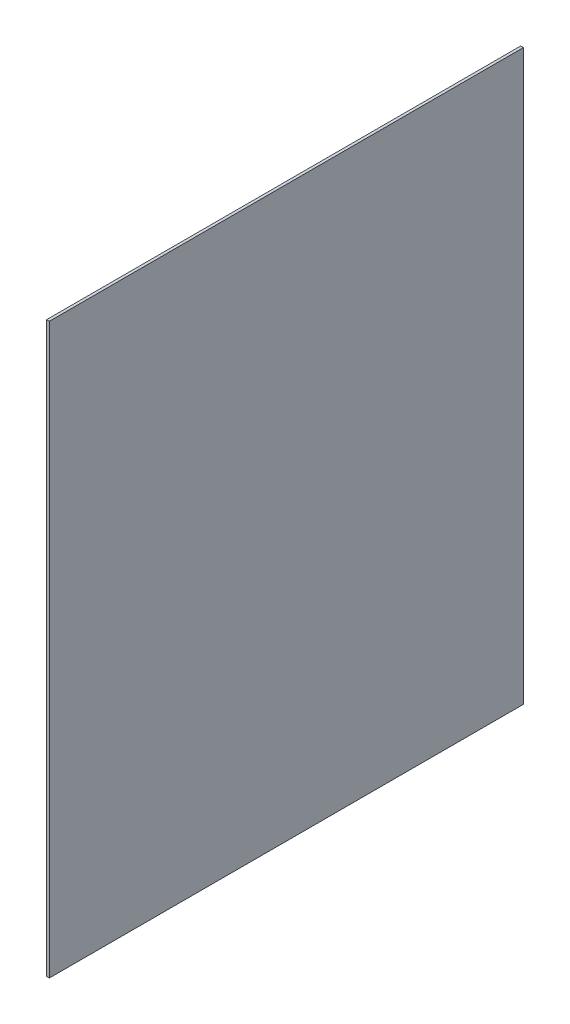
ISO-10303-21;
HEADER;
FILE_DESCRIPTION(('STEP AP214'),'2;1');
FILE_NAME('part.step','',(''),(''),'','','');
FILE_SCHEMA(('AUTOMOTIVE_DESIGN { 1 0 10303 214 1 1 1 1 }'));
ENDSEC;
DATA;
#1=APPLICATION_CONTEXT('core data for automotive mechanical design processes');
#2=APPLICATION_PROTOCOL_DEFINITION('international standard','automotive_design',2000,#1);
#3=PRODUCT_CONTEXT('',#1,'mechanical');
#4=PRODUCT('Part','Part','',(#3));
#5=PRODUCT_RELATED_PRODUCT_CATEGORY('part','',(#4));
#6=PRODUCT_DEFINITION_FORMATION('','',#4);
#7=PRODUCT_DEFINITION_CONTEXT('part definition',#1,'design');
#8=PRODUCT_DEFINITION('design','',#6,#7);
#9=PRODUCT_DEFINITION_SHAPE('','',#8);
#10=(LENGTH_UNIT() NAMED_UNIT(*) SI_UNIT(.MILLI.,.METRE.));
#11=(NAMED_UNIT(*) PLANE_ANGLE_UNIT() SI_UNIT($,.RADIAN.));
#12=(NAMED_UNIT(*) SI_UNIT($,.STERADIAN.) SOLID_ANGLE_UNIT());
#13=UNCERTAINTY_MEASURE_WITH_UNIT(LENGTH_MEASURE(1.E-05),#10,'distance_accuracy_value','');
#14=(GEOMETRIC_REPRESENTATION_CONTEXT(3) GLOBAL_UNCERTAINTY_ASSIGNED_CONTEXT((#13)) GLOBAL_UNIT_ASSIGNED_CONTEXT((#10,
#11,#12)) REPRESENTATION_CONTEXT('',''));
#15=CARTESIAN_POINT('',(0.,0.,0.));
#16=DIRECTION('',(0.,0.,1.));
#17=DIRECTION('',(1.,0.,0.));
#18=AXIS2_PLACEMENT_3D('',#15,#16,#17);
#19=CARTESIAN_POINT('',(-12.5,-2580.0927159835,2150.));
#20=DIRECTION('',(1.,0.,0.));
#21=DIRECTION('',(0.,0.,-1.));
#22=AXIS2_PLACEMENT_3D('',#19,#20,#21);
#23=PLANE('',#22);
#24=DIRECTION('',(0.,-1.,0.));
#25=VECTOR('',#24,1.);
#26=CARTESIAN_POINT('',(-12.5,-2580.0927159835,-2150.));
#27=LINE('',#26,#25);
#28=CARTESIAN_POINT('',(-12.5,2580.0927159835,-2150.));
#29=VERTEX_POINT('',#28);
#30=CARTESIAN_POINT('',(-12.5,-2580.0927159835,-2150.));
#31=VERTEX_POINT('',#30);
#32=EDGE_CURVE('E105',#29,#31,#27,.T.);
#33=ORIENTED_EDGE('',*,*,#32,.T.);
#34=DIRECTION('',(0.,0.,-1.));
#35=VECTOR('',#34,1.);
#36=CARTESIAN_POINT('',(-12.5,-2580.0927159835,2150.));
#37=LINE('',#36,#35);
#38=CARTESIAN_POINT('',(-12.5,-2580.0927159835,2150.));
#39=VERTEX_POINT('',#38);
#40=EDGE_CURVE('E11',#39,#31,#37,.T.);
#41=ORIENTED_EDGE('',*,*,#40,.F.);
#42=DIRECTION('',(0.,-1.,0.));
#43=VECTOR('',#42,1.);
#44=CARTESIAN_POINT('',(-12.5,-2580.0927159835,2150.));
#45=LINE('',#44,#43);
#46=CARTESIAN_POINT('',(-12.5,2580.0927159835,2150.));
#47=VERTEX_POINT('',#46);
#48=EDGE_CURVE('E89',#47,#39,#45,.T.);
#49=ORIENTED_EDGE('',*,*,#48,.F.);
#50=DIRECTION('',(0.,0.,-1.));
#51=VECTOR('',#50,1.);
#52=CARTESIAN_POINT('',(-12.5,2580.0927159835,2150.));
#53=LINE('',#52,#51);
#54=EDGE_CURVE('E98',#47,#29,#53,.T.);
#55=ORIENTED_EDGE('',*,*,#54,.T.);
#56=EDGE_LOOP('',(#33,#41,#49,#55));
#57=FACE_BOUND('',#56,.T.);
#58=ADVANCED_FACE('F39',(#57),#23,.F.);
#59=CARTESIAN_POINT('',(-12.5,-2580.0927159835,2150.));
#60=DIRECTION('',(0.,1.,0.));
#61=DIRECTION('',(0.,0.,1.));
#62=AXIS2_PLACEMENT_3D('',#59,#60,#61);
#63=PLANE('',#62);
#64=DIRECTION('',(1.,0.,0.));
#65=VECTOR('',#64,1.);
#66=CARTESIAN_POINT('',(-12.5,-2580.0927159835,-2150.));
#67=LINE('',#66,#65);
#68=CARTESIAN_POINT('',(12.5,-2580.0927159835,-2150.));
#69=VERTEX_POINT('',#68);
#70=EDGE_CURVE('E94',#31,#69,#67,.T.);
#71=ORIENTED_EDGE('',*,*,#70,.T.);
#72=DIRECTION('',(0.,0.,-1.));
#73=VECTOR('',#72,1.);
#74=CARTESIAN_POINT('',(12.5,-2580.0927159835,2150.));
#75=LINE('',#74,#73);
#76=CARTESIAN_POINT('',(12.5,-2580.0927159835,2150.));
#77=VERTEX_POINT('',#76);
#78=EDGE_CURVE('E50',#77,#69,#75,.T.);
#79=ORIENTED_EDGE('',*,*,#78,.F.);
#80=DIRECTION('',(1.,0.,0.));
#81=VECTOR('',#80,1.);
#82=CARTESIAN_POINT('',(-12.5,-2580.0927159835,2150.));
#83=LINE('',#82,#81);
#84=EDGE_CURVE('E83',#39,#77,#83,.T.);
#85=ORIENTED_EDGE('',*,*,#84,.F.);
#86=ORIENTED_EDGE('',*,*,#40,.T.);
#87=EDGE_LOOP('',(#71,#79,#85,#86));
#88=FACE_BOUND('',#87,.T.);
#89=ADVANCED_FACE('F91',(#88),#63,.F.);
#90=CARTESIAN_POINT('',(12.5,-2580.0927159835,2150.));
#91=DIRECTION('',(-1.,0.,0.));
#92=DIRECTION('',(0.,0.,1.));
#93=AXIS2_PLACEMENT_3D('',#90,#91,#92);
#94=PLANE('',#93);
#95=DIRECTION('',(0.,1.,0.));
#96=VECTOR('',#95,1.);
#97=CARTESIAN_POINT('',(12.5,-2580.0927159835,-2150.));
#98=LINE('',#97,#96);
#99=CARTESIAN_POINT('',(12.5,2580.0927159835,-2150.));
#100=VERTEX_POINT('',#99);
#101=EDGE_CURVE('E75',#69,#100,#98,.T.);
#102=ORIENTED_EDGE('',*,*,#101,.T.);
#103=DIRECTION('',(0.,0.,-1.));
#104=VECTOR('',#103,1.);
#105=CARTESIAN_POINT('',(12.5,2580.0927159835,2150.));
#106=LINE('',#105,#104);
#107=CARTESIAN_POINT('',(12.5,2580.0927159835,2150.));
#108=VERTEX_POINT('',#107);
#109=EDGE_CURVE('E92',#108,#100,#106,.T.);
#110=ORIENTED_EDGE('',*,*,#109,.F.);
#111=DIRECTION('',(0.,1.,0.));
#112=VECTOR('',#111,1.);
#113=CARTESIAN_POINT('',(12.5,-2580.0927159835,2150.));
#114=LINE('',#113,#112);
#115=EDGE_CURVE('E86',#77,#108,#114,.T.);
#116=ORIENTED_EDGE('',*,*,#115,.F.);
#117=ORIENTED_EDGE('',*,*,#78,.T.);
#118=EDGE_LOOP('',(#102,#110,#116,#117));
#119=FACE_BOUND('',#118,.T.);
#120=ADVANCED_FACE('F96',(#119),#94,.F.);
#121=CARTESIAN_POINT('',(-12.5,2580.0927159835,2150.));
#122=DIRECTION('',(0.,-1.,0.));
#123=DIRECTION('',(0.,0.,-1.));
#124=AXIS2_PLACEMENT_3D('',#121,#122,#123);
#125=PLANE('',#124);
#126=DIRECTION('',(-1.,0.,0.));
#127=VECTOR('',#126,1.);
#128=CARTESIAN_POINT('',(-12.5,2580.0927159835,-2150.));
#129=LINE('',#128,#127);
#130=EDGE_CURVE('E79',#100,#29,#129,.T.);
#131=ORIENTED_EDGE('',*,*,#130,.T.);
#132=ORIENTED_EDGE('',*,*,#54,.F.);
#133=DIRECTION('',(-1.,0.,0.));
#134=VECTOR('',#133,1.);
#135=CARTESIAN_POINT('',(-12.5,2580.0927159835,2150.));
#136=LINE('',#135,#134);
#137=EDGE_CURVE('E54',#108,#47,#136,.T.);
#138=ORIENTED_EDGE('',*,*,#137,.F.);
#139=ORIENTED_EDGE('',*,*,#109,.T.);
#140=EDGE_LOOP('',(#131,#132,#138,#139));
#141=FACE_BOUND('',#140,.T.);
#142=ADVANCED_FACE('F108',(#141),#125,.F.);
#143=CARTESIAN_POINT('',(0.,0.,2150.));
#144=DIRECTION('',(0.,0.,-1.));
#145=DIRECTION('',(-1.,0.,0.));
#146=AXIS2_PLACEMENT_3D('',#143,#144,#145);
#147=PLANE('',#146);
#148=ORIENTED_EDGE('',*,*,#48,.T.);
#149=ORIENTED_EDGE('',*,*,#84,.T.);
#150=ORIENTED_EDGE('',*,*,#115,.T.);
#151=ORIENTED_EDGE('',*,*,#137,.T.);
#152=EDGE_LOOP('',(#148,#149,#150,#151));
#153=FACE_BOUND('',#152,.T.);
#154=ADVANCED_FACE('F88',(#153),#147,.F.);
#155=CARTESIAN_POINT('',(0.,0.,-2150.));
#156=DIRECTION('',(0.,0.,-1.));
#157=DIRECTION('',(-1.,0.,0.));
#158=AXIS2_PLACEMENT_3D('',#155,#156,#157);
#159=PLANE('',#158);
#160=ORIENTED_EDGE('',*,*,#32,.F.);
#161=ORIENTED_EDGE('',*,*,#130,.F.);
#162=ORIENTED_EDGE('',*,*,#101,.F.);
#163=ORIENTED_EDGE('',*,*,#70,.F.);
#164=EDGE_LOOP('',(#160,#161,#162,#163));
#165=FACE_BOUND('',#164,.T.);
#166=ADVANCED_FACE('F115',(#165),#159,.T.);
#167=CLOSED_SHELL('',(#58,#89,#120,#142,#154,#166));
#168=MANIFOLD_SOLID_BREP('B2',#167);
#169=ADVANCED_BREP_SHAPE_REPRESENTATION('',(#18,#168),#14);
#170=SHAPE_DEFINITION_REPRESENTATION(#9,#169);
ENDSEC;
END-ISO-10303-21;
